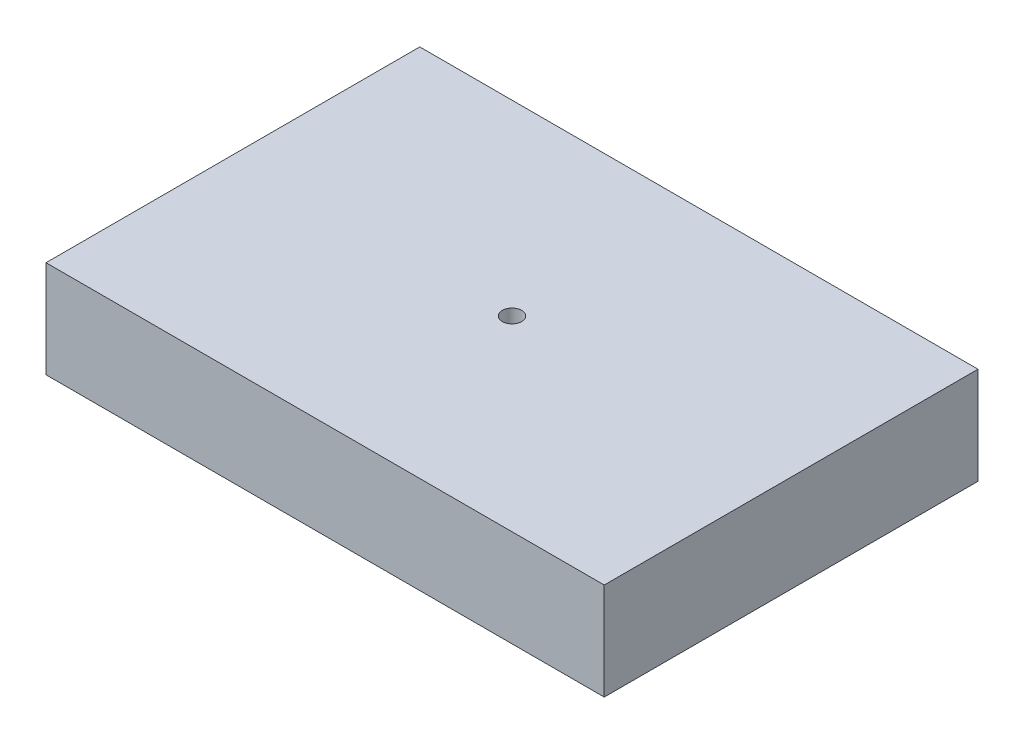
ISO-10303-21;
HEADER;
FILE_DESCRIPTION(('STEP AP214'),'2;1');
FILE_NAME('part.step','',(''),(''),'','','');
FILE_SCHEMA(('AUTOMOTIVE_DESIGN { 1 0 10303 214 1 1 1 1 }'));
ENDSEC;
DATA;
#1=APPLICATION_CONTEXT('core data for automotive mechanical design processes');
#2=APPLICATION_PROTOCOL_DEFINITION('international standard','automotive_design',2000,#1);
#3=PRODUCT_CONTEXT('',#1,'mechanical');
#4=PRODUCT('Part','Part','',(#3));
#5=PRODUCT_RELATED_PRODUCT_CATEGORY('part','',(#4));
#6=PRODUCT_DEFINITION_FORMATION('','',#4);
#7=PRODUCT_DEFINITION_CONTEXT('part definition',#1,'design');
#8=PRODUCT_DEFINITION('design','',#6,#7);
#9=PRODUCT_DEFINITION_SHAPE('','',#8);
#10=(LENGTH_UNIT() NAMED_UNIT(*) SI_UNIT(.MILLI.,.METRE.));
#11=(NAMED_UNIT(*) PLANE_ANGLE_UNIT() SI_UNIT($,.RADIAN.));
#12=(NAMED_UNIT(*) SI_UNIT($,.STERADIAN.) SOLID_ANGLE_UNIT());
#13=UNCERTAINTY_MEASURE_WITH_UNIT(LENGTH_MEASURE(1.E-05),#10,'distance_accuracy_value','');
#14=(GEOMETRIC_REPRESENTATION_CONTEXT(3) GLOBAL_UNCERTAINTY_ASSIGNED_CONTEXT((#13)) GLOBAL_UNIT_ASSIGNED_CONTEXT((#10,
#11,#12)) REPRESENTATION_CONTEXT('',''));
#15=CARTESIAN_POINT('',(0.,0.,0.));
#16=DIRECTION('',(0.,0.,1.));
#17=DIRECTION('',(1.,0.,0.));
#18=AXIS2_PLACEMENT_3D('',#15,#16,#17);
#19=CARTESIAN_POINT('',(0.,-50.,0.));
#20=DIRECTION('',(0.,1.,0.));
#21=DIRECTION('',(0.,0.,1.));
#22=AXIS2_PLACEMENT_3D('',#19,#20,#21);
#23=PLANE('',#22);
#24=CARTESIAN_POINT('',(0.,-50.,0.));
#25=DIRECTION('',(0.,-1.,0.));
#26=DIRECTION('',(-0.938316846236954,0.,0.345776656337492));
#27=AXIS2_PLACEMENT_3D('',#24,#25,#26);
#28=CIRCLE('',#27,15.25);
#29=CARTESIAN_POINT('',(-14.3093319051135,-50.,5.27309400914675));
#30=VERTEX_POINT('',#29);
#31=EDGE_CURVE('E103',#30,#30,#28,.F.);
#32=ORIENTED_EDGE('',*,*,#31,.T.);
#33=EDGE_LOOP('',(#32));
#34=FACE_BOUND('',#33,.T.);
#35=DIRECTION('',(0.,0.,-1.));
#36=VECTOR('',#35,1.);
#37=CARTESIAN_POINT('',(287.5,-50.,-192.5));
#38=LINE('',#37,#36);
#39=CARTESIAN_POINT('',(287.5,-50.,192.5));
#40=VERTEX_POINT('',#39);
#41=CARTESIAN_POINT('',(287.5,-50.,-192.5));
#42=VERTEX_POINT('',#41);
#43=EDGE_CURVE('E101',#40,#42,#38,.T.);
#44=ORIENTED_EDGE('',*,*,#43,.F.);
#45=DIRECTION('',(1.,0.,0.));
#46=VECTOR('',#45,1.);
#47=CARTESIAN_POINT('',(-287.5,-50.,192.5));
#48=LINE('',#47,#46);
#49=CARTESIAN_POINT('',(-287.5,-50.,192.5));
#50=VERTEX_POINT('',#49);
#51=EDGE_CURVE('E77',#50,#40,#48,.T.);
#52=ORIENTED_EDGE('',*,*,#51,.F.);
#53=DIRECTION('',(0.,0.,1.));
#54=VECTOR('',#53,1.);
#55=CARTESIAN_POINT('',(-287.5,-50.,-192.5));
#56=LINE('',#55,#54);
#57=CARTESIAN_POINT('',(-287.5,-50.,-192.5));
#58=VERTEX_POINT('',#57);
#59=EDGE_CURVE('E83',#58,#50,#56,.T.);
#60=ORIENTED_EDGE('',*,*,#59,.F.);
#61=DIRECTION('',(-1.,0.,0.));
#62=VECTOR('',#61,1.);
#63=CARTESIAN_POINT('',(-287.5,-50.,-192.5));
#64=LINE('',#63,#62);
#65=EDGE_CURVE('E52',#42,#58,#64,.T.);
#66=ORIENTED_EDGE('',*,*,#65,.F.);
#67=EDGE_LOOP('',(#44,#52,#60,#66));
#68=FACE_BOUND('',#67,.T.);
#69=ADVANCED_FACE('F33',(#34,#68),#23,.F.);
#70=CARTESIAN_POINT('',(287.5,50.,-192.5));
#71=DIRECTION('',(-1.,0.,0.));
#72=DIRECTION('',(0.,0.,1.));
#73=AXIS2_PLACEMENT_3D('',#70,#71,#72);
#74=PLANE('',#73);
#75=ORIENTED_EDGE('',*,*,#43,.T.);
#76=DIRECTION('',(0.,-1.,0.));
#77=VECTOR('',#76,1.);
#78=CARTESIAN_POINT('',(287.5,50.,-192.5));
#79=LINE('',#78,#77);
#80=CARTESIAN_POINT('',(287.5,50.,-192.5));
#81=VERTEX_POINT('',#80);
#82=EDGE_CURVE('E89',#81,#42,#79,.T.);
#83=ORIENTED_EDGE('',*,*,#82,.F.);
#84=DIRECTION('',(0.,0.,-1.));
#85=VECTOR('',#84,1.);
#86=CARTESIAN_POINT('',(287.5,50.,-192.5));
#87=LINE('',#86,#85);
#88=CARTESIAN_POINT('',(287.5,50.,192.5));
#89=VERTEX_POINT('',#88);
#90=EDGE_CURVE('E109',#89,#81,#87,.T.);
#91=ORIENTED_EDGE('',*,*,#90,.F.);
#92=DIRECTION('',(0.,-1.,0.));
#93=VECTOR('',#92,1.);
#94=CARTESIAN_POINT('',(287.5,50.,192.5));
#95=LINE('',#94,#93);
#96=EDGE_CURVE('E91',#89,#40,#95,.T.);
#97=ORIENTED_EDGE('',*,*,#96,.T.);
#98=EDGE_LOOP('',(#75,#83,#91,#97));
#99=FACE_BOUND('',#98,.T.);
#100=ADVANCED_FACE('F141',(#99),#74,.F.);
#101=CARTESIAN_POINT('',(-287.5,50.,-192.5));
#102=DIRECTION('',(0.,0.,1.));
#103=DIRECTION('',(1.,0.,0.));
#104=AXIS2_PLACEMENT_3D('',#101,#102,#103);
#105=PLANE('',#104);
#106=ORIENTED_EDGE('',*,*,#65,.T.);
#107=DIRECTION('',(0.,-1.,0.));
#108=VECTOR('',#107,1.);
#109=CARTESIAN_POINT('',(-287.5,50.,-192.5));
#110=LINE('',#109,#108);
#111=CARTESIAN_POINT('',(-287.5,50.,-192.5));
#112=VERTEX_POINT('',#111);
#113=EDGE_CURVE('E86',#112,#58,#110,.T.);
#114=ORIENTED_EDGE('',*,*,#113,.F.);
#115=DIRECTION('',(-1.,0.,0.));
#116=VECTOR('',#115,1.);
#117=CARTESIAN_POINT('',(-287.5,50.,-192.5));
#118=LINE('',#117,#116);
#119=EDGE_CURVE('E68',#81,#112,#118,.T.);
#120=ORIENTED_EDGE('',*,*,#119,.F.);
#121=ORIENTED_EDGE('',*,*,#82,.T.);
#122=EDGE_LOOP('',(#106,#114,#120,#121));
#123=FACE_BOUND('',#122,.T.);
#124=ADVANCED_FACE('F85',(#123),#105,.F.);
#125=CARTESIAN_POINT('',(-287.5,50.,-192.5));
#126=DIRECTION('',(1.,0.,0.));
#127=DIRECTION('',(0.,0.,-1.));
#128=AXIS2_PLACEMENT_3D('',#125,#126,#127);
#129=PLANE('',#128);
#130=ORIENTED_EDGE('',*,*,#59,.T.);
#131=DIRECTION('',(0.,-1.,0.));
#132=VECTOR('',#131,1.);
#133=CARTESIAN_POINT('',(-287.5,50.,192.5));
#134=LINE('',#133,#132);
#135=CARTESIAN_POINT('',(-287.5,50.,192.5));
#136=VERTEX_POINT('',#135);
#137=EDGE_CURVE('E113',#136,#50,#134,.T.);
#138=ORIENTED_EDGE('',*,*,#137,.F.);
#139=DIRECTION('',(0.,0.,1.));
#140=VECTOR('',#139,1.);
#141=CARTESIAN_POINT('',(-287.5,50.,-192.5));
#142=LINE('',#141,#140);
#143=EDGE_CURVE('E94',#112,#136,#142,.T.);
#144=ORIENTED_EDGE('',*,*,#143,.F.);
#145=ORIENTED_EDGE('',*,*,#113,.T.);
#146=EDGE_LOOP('',(#130,#138,#144,#145));
#147=FACE_BOUND('',#146,.T.);
#148=ADVANCED_FACE('F93',(#147),#129,.F.);
#149=CARTESIAN_POINT('',(-287.5,50.,192.5));
#150=DIRECTION('',(0.,0.,-1.));
#151=DIRECTION('',(-1.,0.,0.));
#152=AXIS2_PLACEMENT_3D('',#149,#150,#151);
#153=PLANE('',#152);
#154=ORIENTED_EDGE('',*,*,#51,.T.);
#155=ORIENTED_EDGE('',*,*,#96,.F.);
#156=DIRECTION('',(1.,0.,0.));
#157=VECTOR('',#156,1.);
#158=CARTESIAN_POINT('',(-287.5,50.,192.5));
#159=LINE('',#158,#157);
#160=EDGE_CURVE('E104',#136,#89,#159,.T.);
#161=ORIENTED_EDGE('',*,*,#160,.F.);
#162=ORIENTED_EDGE('',*,*,#137,.T.);
#163=EDGE_LOOP('',(#154,#155,#161,#162));
#164=FACE_BOUND('',#163,.T.);
#165=ADVANCED_FACE('F158',(#164),#153,.F.);
#166=CARTESIAN_POINT('',(0.,50.,0.));
#167=DIRECTION('',(0.,1.,0.));
#168=DIRECTION('',(0.,0.,1.));
#169=AXIS2_PLACEMENT_3D('',#166,#167,#168);
#170=PLANE('',#169);
#171=CARTESIAN_POINT('',(0.,50.,0.));
#172=DIRECTION('',(0.,-1.,0.));
#173=DIRECTION('',(0.660231089935219,0.,-0.751062519290474));
#174=AXIS2_PLACEMENT_3D('',#171,#172,#173);
#175=CIRCLE('',#174,10.);
#176=CARTESIAN_POINT('',(6.60231089935218,50.,-7.51062519290474));
#177=VERTEX_POINT('',#176);
#178=EDGE_CURVE('E111',#177,#177,#175,.T.);
#179=ORIENTED_EDGE('',*,*,#178,.T.);
#180=EDGE_LOOP('',(#179));
#181=FACE_BOUND('',#180,.T.);
#182=ORIENTED_EDGE('',*,*,#90,.T.);
#183=ORIENTED_EDGE('',*,*,#119,.T.);
#184=ORIENTED_EDGE('',*,*,#143,.T.);
#185=ORIENTED_EDGE('',*,*,#160,.T.);
#186=EDGE_LOOP('',(#182,#183,#184,#185));
#187=FACE_BOUND('',#186,.T.);
#188=ADVANCED_FACE('F35',(#181,#187),#170,.T.);
#189=CARTESIAN_POINT('',(0.,-30.,0.));
#190=DIRECTION('',(0.,-1.,0.));
#191=DIRECTION('',(-0.938316846236954,0.,0.345776656337492));
#192=AXIS2_PLACEMENT_3D('',#189,#190,#191);
#193=CYLINDRICAL_SURFACE('',#192,15.25);
#194=CARTESIAN_POINT('',(0.,-30.,0.));
#195=DIRECTION('',(0.,1.,0.));
#196=DIRECTION('',(0.938316846236954,0.,-0.345776656337492));
#197=AXIS2_PLACEMENT_3D('',#194,#195,#196);
#198=CIRCLE('',#197,15.25);
#199=CARTESIAN_POINT('',(14.3093319051136,-30.,-5.27309400914675));
#200=VERTEX_POINT('',#199);
#201=EDGE_CURVE('E106',#200,#200,#198,.T.);
#202=ORIENTED_EDGE('',*,*,#201,.T.);
#203=EDGE_LOOP('',(#202));
#204=FACE_BOUND('',#203,.T.);
#205=ORIENTED_EDGE('',*,*,#31,.F.);
#206=EDGE_LOOP('',(#205));
#207=FACE_BOUND('',#206,.T.);
#208=ADVANCED_FACE('F137',(#204,#207),#193,.F.);
#209=CARTESIAN_POINT('',(0.,-30.,0.));
#210=DIRECTION('',(0.,1.,0.));
#211=DIRECTION('',(0.938316846236954,0.,-0.345776656337492));
#212=AXIS2_PLACEMENT_3D('',#209,#210,#211);
#213=PLANE('',#212);
#214=ORIENTED_EDGE('',*,*,#201,.F.);
#215=EDGE_LOOP('',(#214));
#216=FACE_BOUND('',#215,.T.);
#217=CARTESIAN_POINT('',(0.,-30.,0.));
#218=DIRECTION('',(0.,1.,0.));
#219=DIRECTION('',(0.938316846236954,0.,-0.345776656337492));
#220=AXIS2_PLACEMENT_3D('',#217,#218,#219);
#221=CIRCLE('',#220,10.25);
#222=CARTESIAN_POINT('',(9.61774767392879,-30.,-3.54421072745929));
#223=VERTEX_POINT('',#222);
#224=EDGE_CURVE('E37',#223,#223,#221,.T.);
#225=ORIENTED_EDGE('',*,*,#224,.T.);
#226=EDGE_LOOP('',(#225));
#227=FACE_BOUND('',#226,.T.);
#228=ADVANCED_FACE('F124',(#216,#227),#213,.F.);
#229=CARTESIAN_POINT('',(0.,-30.,0.));
#230=DIRECTION('',(0.,-1.,0.));
#231=DIRECTION('',(-0.938316846236954,0.,0.345776656337492));
#232=AXIS2_PLACEMENT_3D('',#229,#230,#231);
#233=CYLINDRICAL_SURFACE('',#232,10.25);
#234=ORIENTED_EDGE('',*,*,#224,.F.);
#235=EDGE_LOOP('',(#234));
#236=FACE_BOUND('',#235,.T.);
#237=CARTESIAN_POINT('',(0.,-50.,0.));
#238=DIRECTION('',(0.,1.,0.));
#239=DIRECTION('',(0.938316846236954,0.,-0.345776656337492));
#240=AXIS2_PLACEMENT_3D('',#237,#238,#239);
#241=CIRCLE('',#240,10.25);
#242=CARTESIAN_POINT('',(9.61774767392879,-50.,-3.54421072745929));
#243=VERTEX_POINT('',#242);
#244=EDGE_CURVE('E43',#243,#243,#241,.T.);
#245=ORIENTED_EDGE('',*,*,#244,.T.);
#246=EDGE_LOOP('',(#245));
#247=FACE_BOUND('',#246,.T.);
#248=ADVANCED_FACE('F126',(#236,#247),#233,.T.);
#249=CARTESIAN_POINT('',(0.,-50.,0.));
#250=DIRECTION('',(0.,1.,0.));
#251=DIRECTION('',(-0.660231089935219,0.,0.751062519290474));
#252=AXIS2_PLACEMENT_3D('',#249,#250,#251);
#253=CYLINDRICAL_SURFACE('',#252,10.);
#254=CARTESIAN_POINT('',(0.,-50.,0.));
#255=DIRECTION('',(0.,-1.,0.));
#256=DIRECTION('',(0.660231089935219,0.,-0.751062519290474));
#257=AXIS2_PLACEMENT_3D('',#254,#255,#256);
#258=CIRCLE('',#257,10.);
#259=CARTESIAN_POINT('',(6.60231089935219,-50.,-7.51062519290474));
#260=VERTEX_POINT('',#259);
#261=EDGE_CURVE('E11',#260,#260,#258,.T.);
#262=ORIENTED_EDGE('',*,*,#261,.T.);
#263=EDGE_LOOP('',(#262));
#264=FACE_BOUND('',#263,.T.);
#265=ORIENTED_EDGE('',*,*,#178,.F.);
#266=EDGE_LOOP('',(#265));
#267=FACE_BOUND('',#266,.T.);
#268=ADVANCED_FACE('F128',(#264,#267),#253,.F.);
#269=ORIENTED_EDGE('',*,*,#261,.F.);
#270=EDGE_LOOP('',(#269));
#271=FACE_BOUND('',#270,.T.);
#272=ORIENTED_EDGE('',*,*,#244,.F.);
#273=EDGE_LOOP('',(#272));
#274=FACE_BOUND('',#273,.T.);
#275=ADVANCED_FACE('F134',(#271,#274),#23,.F.);
#276=CLOSED_SHELL('',(#69,#100,#124,#148,#165,#188,#208,#228,#248,#268,#275));
#277=MANIFOLD_SOLID_BREP('B2',#276);
#278=ADVANCED_BREP_SHAPE_REPRESENTATION('',(#18,#277),#14);
#279=SHAPE_DEFINITION_REPRESENTATION(#9,#278);
ENDSEC;
END-ISO-10303-21;
